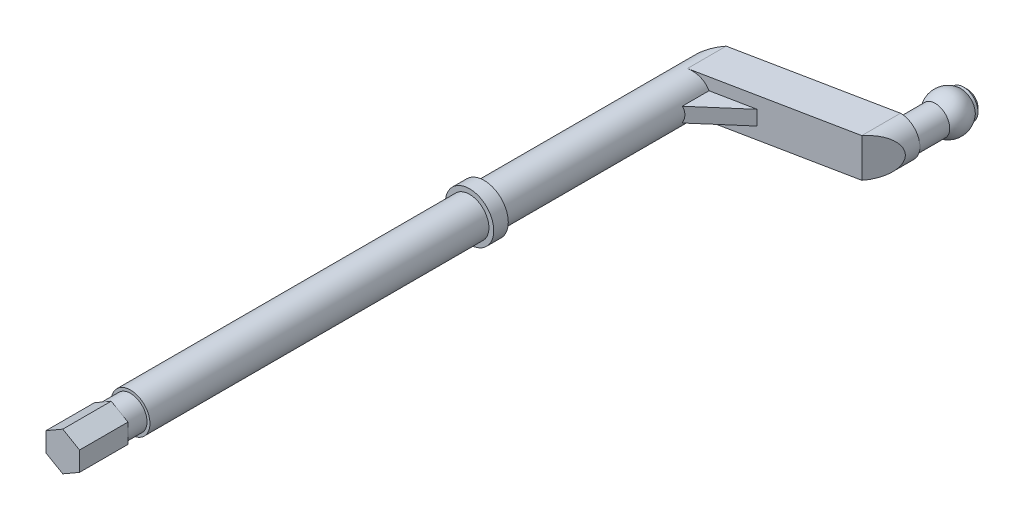
ISO-10303-21;
HEADER;
FILE_DESCRIPTION(('STEP AP214'),'2;1');
FILE_NAME('part.step','',(''),(''),'','','');
FILE_SCHEMA(('AUTOMOTIVE_DESIGN { 1 0 10303 214 1 1 1 1 }'));
ENDSEC;
DATA;
#1=APPLICATION_CONTEXT('core data for automotive mechanical design processes');
#2=APPLICATION_PROTOCOL_DEFINITION('international standard','automotive_design',2000,#1);
#3=PRODUCT_CONTEXT('',#1,'mechanical');
#4=PRODUCT('Part','Part','',(#3));
#5=PRODUCT_RELATED_PRODUCT_CATEGORY('part','',(#4));
#6=PRODUCT_DEFINITION_FORMATION('','',#4);
#7=PRODUCT_DEFINITION_CONTEXT('part definition',#1,'design');
#8=PRODUCT_DEFINITION('design','',#6,#7);
#9=PRODUCT_DEFINITION_SHAPE('','',#8);
#10=(LENGTH_UNIT() NAMED_UNIT(*) SI_UNIT(.MILLI.,.METRE.));
#11=(NAMED_UNIT(*) PLANE_ANGLE_UNIT() SI_UNIT($,.RADIAN.));
#12=(NAMED_UNIT(*) SI_UNIT($,.STERADIAN.) SOLID_ANGLE_UNIT());
#13=UNCERTAINTY_MEASURE_WITH_UNIT(LENGTH_MEASURE(1.E-05),#10,'distance_accuracy_value','');
#14=(GEOMETRIC_REPRESENTATION_CONTEXT(3) GLOBAL_UNCERTAINTY_ASSIGNED_CONTEXT((#13)) GLOBAL_UNIT_ASSIGNED_CONTEXT((#10,
#11,#12)) REPRESENTATION_CONTEXT('',''));
#15=CARTESIAN_POINT('',(0.,0.,0.));
#16=DIRECTION('',(0.,0.,1.));
#17=DIRECTION('',(1.,0.,0.));
#18=AXIS2_PLACEMENT_3D('',#15,#16,#17);
#19=CARTESIAN_POINT('',(0.,0.,61.5));
#20=DIRECTION('',(0.,0.,-1.));
#21=DIRECTION('',(-1.,0.,0.));
#22=AXIS2_PLACEMENT_3D('',#19,#20,#21);
#23=CYLINDRICAL_SURFACE('',#22,2.);
#24=CARTESIAN_POINT('',(0.,0.,25.));
#25=DIRECTION('',(0.,0.,1.));
#26=DIRECTION('',(1.,0.,0.));
#27=AXIS2_PLACEMENT_3D('',#24,#25,#26);
#28=CIRCLE('',#27,2.);
#29=CARTESIAN_POINT('',(2.,0.,25.));
#30=VERTEX_POINT('',#29);
#31=EDGE_CURVE('E147',#30,#30,#28,.T.);
#32=ORIENTED_EDGE('',*,*,#31,.F.);
#33=EDGE_LOOP('',(#32));
#34=FACE_BOUND('',#33,.T.);
#35=DIRECTION('',(0.,0.,-1.));
#36=VECTOR('',#35,1.);
#37=CARTESIAN_POINT('',(1.85404962177392,-0.75,61.5));
#38=LINE('',#37,#36);
#39=CARTESIAN_POINT('',(1.85404962177386,-0.75,6.39315699446265));
#40=VERTEX_POINT('',#39);
#41=CARTESIAN_POINT('',(1.85404962177392,-0.75,3.62919007564522));
#42=VERTEX_POINT('',#41);
#43=EDGE_CURVE('E49',#40,#42,#38,.T.);
#44=ORIENTED_EDGE('',*,*,#43,.F.);
#45=CARTESIAN_POINT('',(0.,0.,8.00000000000016));
#46=DIRECTION('',(0.654930538417853,0.,0.755689082789808));
#47=DIRECTION('',(0.755689082789808,0.,-0.654930538417853));
#48=AXIS2_PLACEMENT_3D('',#45,#46,#47);
#49=ELLIPSE('',#48,2.64659109883726,2.);
#50=CARTESIAN_POINT('',(1.85404962177392,0.75,6.39315699446261));
#51=VERTEX_POINT('',#50);
#52=EDGE_CURVE('E53',#40,#51,#49,.T.);
#53=ORIENTED_EDGE('',*,*,#52,.T.);
#54=DIRECTION('',(0.,0.,-1.));
#55=VECTOR('',#54,1.);
#56=CARTESIAN_POINT('',(1.85404962177392,0.75,61.5));
#57=LINE('',#56,#55);
#58=CARTESIAN_POINT('',(1.85404962177392,0.75,3.62919007564522));
#59=VERTEX_POINT('',#58);
#60=EDGE_CURVE('E149',#51,#59,#57,.T.);
#61=ORIENTED_EDGE('',*,*,#60,.T.);
#62=CARTESIAN_POINT('',(0.,0.,4.));
#63=DIRECTION('',(0.196116135138184,0.,0.98058067569092));
#64=DIRECTION('',(0.98058067569092,0.,-0.196116135138184));
#65=AXIS2_PLACEMENT_3D('',#62,#63,#64);
#66=ELLIPSE('',#65,2.03960780543711,2.);
#67=CARTESIAN_POINT('',(0.,2.,4.));
#68=VERTEX_POINT('',#67);
#69=EDGE_CURVE('E136',#59,#68,#66,.T.);
#70=ORIENTED_EDGE('',*,*,#69,.T.);
#71=DIRECTION('',(0.,0.,1.));
#72=VECTOR('',#71,1.);
#73=CARTESIAN_POINT('',(0.,2.,4.));
#74=LINE('',#73,#72);
#75=CARTESIAN_POINT('',(0.,2.,0.));
#76=VERTEX_POINT('',#75);
#77=EDGE_CURVE('E190',#76,#68,#74,.T.);
#78=ORIENTED_EDGE('',*,*,#77,.F.);
#79=CARTESIAN_POINT('',(0.,0.,0.));
#80=DIRECTION('',(0.78086880944303,0.,0.624695047554424));
#81=DIRECTION('',(0.624695047554424,0.,-0.78086880944303));
#82=AXIS2_PLACEMENT_3D('',#79,#80,#81);
#83=ELLIPSE('',#82,3.20156211871643,2.);
#84=CARTESIAN_POINT('',(0.,-2.,0.));
#85=VERTEX_POINT('',#84);
#86=EDGE_CURVE('E185',#85,#76,#83,.F.);
#87=ORIENTED_EDGE('',*,*,#86,.F.);
#88=DIRECTION('',(0.,0.,1.));
#89=VECTOR('',#88,1.);
#90=CARTESIAN_POINT('',(0.,-2.,4.));
#91=LINE('',#90,#89);
#92=CARTESIAN_POINT('',(0.,-2.,4.));
#93=VERTEX_POINT('',#92);
#94=EDGE_CURVE('E199',#85,#93,#91,.T.);
#95=ORIENTED_EDGE('',*,*,#94,.T.);
#96=EDGE_CURVE('E146',#93,#42,#66,.T.);
#97=ORIENTED_EDGE('',*,*,#96,.T.);
#98=EDGE_LOOP('',(#44,#53,#61,#70,#78,#87,#95,#97));
#99=FACE_BOUND('',#98,.T.);
#100=ADVANCED_FACE('F34',(#34,#99),#23,.T.);
#101=CARTESIAN_POINT('',(15.,-2.,1.));
#102=DIRECTION('',(0.196116135138184,0.,0.98058067569092));
#103=DIRECTION('',(0.98058067569092,0.,-0.196116135138184));
#104=AXIS2_PLACEMENT_3D('',#101,#102,#103);
#105=PLANE('',#104);
#106=DIRECTION('',(0.,1.,0.));
#107=VECTOR('',#106,1.);
#108=CARTESIAN_POINT('',(6.,-2.,2.8));
#109=LINE('',#108,#107);
#110=CARTESIAN_POINT('',(6.,-0.75,2.8));
#111=VERTEX_POINT('',#110);
#112=CARTESIAN_POINT('',(5.99999999999998,0.75,2.80000000000001));
#113=VERTEX_POINT('',#112);
#114=EDGE_CURVE('E42',#111,#113,#109,.T.);
#115=ORIENTED_EDGE('',*,*,#114,.F.);
#116=DIRECTION('',(-0.98058067569092,0.,0.196116135138184));
#117=VECTOR('',#116,1.);
#118=CARTESIAN_POINT('',(15.,-0.75,1.));
#119=LINE('',#118,#117);
#120=EDGE_CURVE('E11',#111,#42,#119,.T.);
#121=ORIENTED_EDGE('',*,*,#120,.T.);
#122=ORIENTED_EDGE('',*,*,#96,.F.);
#123=DIRECTION('',(0.98058067569092,0.,-0.196116135138184));
#124=VECTOR('',#123,1.);
#125=CARTESIAN_POINT('',(15.,-2.,1.));
#126=LINE('',#125,#124);
#127=CARTESIAN_POINT('',(15.,-2.,1.));
#128=VERTEX_POINT('',#127);
#129=EDGE_CURVE('E202',#93,#128,#126,.T.);
#130=ORIENTED_EDGE('',*,*,#129,.T.);
#131=DIRECTION('',(0.,1.,0.));
#132=VECTOR('',#131,1.);
#133=CARTESIAN_POINT('',(15.,-2.,1.));
#134=LINE('',#133,#132);
#135=CARTESIAN_POINT('',(15.,2.,1.));
#136=VERTEX_POINT('',#135);
#137=EDGE_CURVE('E211',#128,#136,#134,.T.);
#138=ORIENTED_EDGE('',*,*,#137,.T.);
#139=DIRECTION('',(0.98058067569092,0.,-0.196116135138184));
#140=VECTOR('',#139,1.);
#141=CARTESIAN_POINT('',(15.,2.,1.));
#142=LINE('',#141,#140);
#143=EDGE_CURVE('E143',#68,#136,#142,.T.);
#144=ORIENTED_EDGE('',*,*,#143,.F.);
#145=ORIENTED_EDGE('',*,*,#69,.F.);
#146=DIRECTION('',(-0.98058067569092,0.,0.196116135138184));
#147=VECTOR('',#146,1.);
#148=CARTESIAN_POINT('',(15.,0.75,1.));
#149=LINE('',#148,#147);
#150=EDGE_CURVE('E139',#113,#59,#149,.T.);
#151=ORIENTED_EDGE('',*,*,#150,.F.);
#152=EDGE_LOOP('',(#115,#121,#122,#130,#138,#144,#145,#151));
#153=FACE_BOUND('',#152,.T.);
#154=ADVANCED_FACE('F137',(#153),#105,.T.);
#155=CARTESIAN_POINT('',(15.4,0.,500000.));
#156=DIRECTION('',(0.,0.,-1.));
#157=DIRECTION('',(-1.,0.,0.));
#158=AXIS2_PLACEMENT_3D('',#155,#156,#157);
#159=CYLINDRICAL_SURFACE('',#158,1.5);
#160=CARTESIAN_POINT('',(15.4,0.,-3.07999999995445));
#161=DIRECTION('',(-0.196116135138184,0.,-0.98058067569092));
#162=DIRECTION('',(0.98058067569092,0.,-0.196116135138184));
#163=AXIS2_PLACEMENT_3D('',#160,#161,#162);
#164=ELLIPSE('',#163,1.52970585407784,1.5);
#165=CARTESIAN_POINT('',(15.,1.4456832294801,-3.));
#166=VERTEX_POINT('',#165);
#167=CARTESIAN_POINT('',(15.,-1.4456832294801,-3.));
#168=VERTEX_POINT('',#167);
#169=EDGE_CURVE('E176',#166,#168,#164,.F.);
#170=ORIENTED_EDGE('',*,*,#169,.F.);
#171=CARTESIAN_POINT('',(15.4,0.,-3.));
#172=DIRECTION('',(0.,0.,-1.));
#173=DIRECTION('',(-1.,0.,0.));
#174=AXIS2_PLACEMENT_3D('',#171,#172,#173);
#175=CIRCLE('',#174,1.5);
#176=EDGE_CURVE('E168',#166,#168,#175,.T.);
#177=ORIENTED_EDGE('',*,*,#176,.T.);
#178=EDGE_LOOP('',(#170,#177));
#179=FACE_BOUND('',#178,.T.);
#180=CARTESIAN_POINT('',(15.4,0.,-6.17712434446088));
#181=DIRECTION('',(0.,0.,-1.));
#182=DIRECTION('',(-1.,0.,0.));
#183=AXIS2_PLACEMENT_3D('',#180,#181,#182);
#184=CIRCLE('',#183,1.5);
#185=CARTESIAN_POINT('',(16.899999999994,0.,-6.17712434446088));
#186=VERTEX_POINT('',#185);
#187=EDGE_CURVE('E169',#186,#186,#184,.F.);
#188=ORIENTED_EDGE('',*,*,#187,.T.);
#189=EDGE_LOOP('',(#188));
#190=FACE_BOUND('',#189,.T.);
#191=ADVANCED_FACE('F301',(#179,#190),#159,.T.);
#192=CARTESIAN_POINT('',(0.,-2.,0.));
#193=DIRECTION('',(-0.196116135138184,0.,-0.98058067569092));
#194=DIRECTION('',(-0.98058067569092,0.,0.196116135138184));
#195=AXIS2_PLACEMENT_3D('',#192,#193,#194);
#196=PLANE('',#195);
#197=ORIENTED_EDGE('',*,*,#169,.T.);
#198=DIRECTION('',(0.,1.,0.));
#199=VECTOR('',#198,1.);
#200=CARTESIAN_POINT('',(15.,-2.501,-3.));
#201=LINE('',#200,#199);
#202=CARTESIAN_POINT('',(15.,-2.,-3.));
#203=VERTEX_POINT('',#202);
#204=EDGE_CURVE('E175',#203,#168,#201,.T.);
#205=ORIENTED_EDGE('',*,*,#204,.F.);
#206=DIRECTION('',(-0.98058067569092,0.,0.196116135138184));
#207=VECTOR('',#206,1.);
#208=CARTESIAN_POINT('',(0.,-2.,0.));
#209=LINE('',#208,#207);
#210=EDGE_CURVE('E208',#203,#85,#209,.T.);
#211=ORIENTED_EDGE('',*,*,#210,.T.);
#212=DIRECTION('',(0.,1.,0.));
#213=VECTOR('',#212,1.);
#214=CARTESIAN_POINT('',(0.,-2.,0.));
#215=LINE('',#214,#213);
#216=EDGE_CURVE('E212',#85,#76,#215,.T.);
#217=ORIENTED_EDGE('',*,*,#216,.T.);
#218=DIRECTION('',(-0.98058067569092,0.,0.196116135138184));
#219=VECTOR('',#218,1.);
#220=CARTESIAN_POINT('',(0.,2.,0.));
#221=LINE('',#220,#219);
#222=CARTESIAN_POINT('',(15.,2.,-3.));
#223=VERTEX_POINT('',#222);
#224=EDGE_CURVE('E196',#223,#76,#221,.T.);
#225=ORIENTED_EDGE('',*,*,#224,.F.);
#226=EDGE_CURVE('E172',#166,#223,#201,.T.);
#227=ORIENTED_EDGE('',*,*,#226,.F.);
#228=EDGE_LOOP('',(#197,#205,#211,#217,#225,#227));
#229=FACE_BOUND('',#228,.T.);
#230=ADVANCED_FACE('F298',(#229),#196,.T.);
#231=CARTESIAN_POINT('',(0.,0.,61.5));
#232=DIRECTION('',(0.,0.,1.));
#233=DIRECTION('',(1.,0.,0.));
#234=AXIS2_PLACEMENT_3D('',#231,#232,#233);
#235=PLANE('',#234);
#236=CARTESIAN_POINT('',(0.,0.,61.5));
#237=DIRECTION('',(0.,0.,1.));
#238=DIRECTION('',(1.,0.,0.));
#239=AXIS2_PLACEMENT_3D('',#236,#237,#238);
#240=CIRCLE('',#239,2.);
#241=CARTESIAN_POINT('',(2.,0.,61.5));
#242=VERTEX_POINT('',#241);
#243=EDGE_CURVE('E273',#242,#242,#240,.T.);
#244=ORIENTED_EDGE('',*,*,#243,.T.);
#245=EDGE_LOOP('',(#244));
#246=FACE_BOUND('',#245,.T.);
#247=CARTESIAN_POINT('',(0.,0.,61.5));
#248=DIRECTION('',(0.,0.,1.));
#249=DIRECTION('',(1.,0.,0.));
#250=AXIS2_PLACEMENT_3D('',#247,#248,#249);
#251=CIRCLE('',#250,1.7);
#252=CARTESIAN_POINT('',(1.7,0.,61.5));
#253=VERTEX_POINT('',#252);
#254=EDGE_CURVE('E260',#253,#253,#251,.T.);
#255=ORIENTED_EDGE('',*,*,#254,.F.);
#256=EDGE_LOOP('',(#255));
#257=FACE_BOUND('',#256,.T.);
#258=ADVANCED_FACE('F355',(#246,#257),#235,.T.);
#259=CARTESIAN_POINT('',(0.,0.,25.));
#260=DIRECTION('',(0.,0.,1.));
#261=DIRECTION('',(1.,0.,0.));
#262=AXIS2_PLACEMENT_3D('',#259,#260,#261);
#263=PLANE('',#262);
#264=CARTESIAN_POINT('',(0.,0.,25.));
#265=DIRECTION('',(0.,0.,1.));
#266=DIRECTION('',(1.,0.,0.));
#267=AXIS2_PLACEMENT_3D('',#264,#265,#266);
#268=CIRCLE('',#267,2.5);
#269=CARTESIAN_POINT('',(2.5,0.,25.));
#270=VERTEX_POINT('',#269);
#271=EDGE_CURVE('E267',#270,#270,#268,.T.);
#272=ORIENTED_EDGE('',*,*,#271,.F.);
#273=EDGE_LOOP('',(#272));
#274=FACE_BOUND('',#273,.T.);
#275=ORIENTED_EDGE('',*,*,#31,.T.);
#276=EDGE_LOOP('',(#275));
#277=FACE_BOUND('',#276,.T.);
#278=ADVANCED_FACE('F358',(#274,#277),#263,.F.);
#279=CARTESIAN_POINT('',(0.,0.,26.5));
#280=DIRECTION('',(0.,0.,1.));
#281=DIRECTION('',(1.,0.,0.));
#282=AXIS2_PLACEMENT_3D('',#279,#280,#281);
#283=PLANE('',#282);
#284=CARTESIAN_POINT('',(0.,0.,26.5));
#285=DIRECTION('',(0.,0.,1.));
#286=DIRECTION('',(1.,0.,0.));
#287=AXIS2_PLACEMENT_3D('',#284,#285,#286);
#288=CIRCLE('',#287,2.5);
#289=CARTESIAN_POINT('',(2.5,0.,26.5));
#290=VERTEX_POINT('',#289);
#291=EDGE_CURVE('E264',#290,#290,#288,.T.);
#292=ORIENTED_EDGE('',*,*,#291,.T.);
#293=EDGE_LOOP('',(#292));
#294=FACE_BOUND('',#293,.T.);
#295=CARTESIAN_POINT('',(0.,0.,26.5));
#296=DIRECTION('',(0.,0.,1.));
#297=DIRECTION('',(1.,0.,0.));
#298=AXIS2_PLACEMENT_3D('',#295,#296,#297);
#299=CIRCLE('',#298,2.);
#300=CARTESIAN_POINT('',(2.,0.,26.5));
#301=VERTEX_POINT('',#300);
#302=EDGE_CURVE('E270',#301,#301,#299,.T.);
#303=ORIENTED_EDGE('',*,*,#302,.F.);
#304=EDGE_LOOP('',(#303));
#305=FACE_BOUND('',#304,.T.);
#306=ADVANCED_FACE('F348',(#294,#305),#283,.T.);
#307=CARTESIAN_POINT('',(0.,0.,25.));
#308=DIRECTION('',(0.,0.,1.));
#309=DIRECTION('',(1.,0.,0.));
#310=AXIS2_PLACEMENT_3D('',#307,#308,#309);
#311=CYLINDRICAL_SURFACE('',#310,2.5);
#312=ORIENTED_EDGE('',*,*,#271,.T.);
#313=EDGE_LOOP('',(#312));
#314=FACE_BOUND('',#313,.T.);
#315=ORIENTED_EDGE('',*,*,#291,.F.);
#316=EDGE_LOOP('',(#315));
#317=FACE_BOUND('',#316,.T.);
#318=ADVANCED_FACE('F339',(#314,#317),#311,.T.);
#319=ORIENTED_EDGE('',*,*,#302,.T.);
#320=EDGE_LOOP('',(#319));
#321=FACE_BOUND('',#320,.T.);
#322=ORIENTED_EDGE('',*,*,#243,.F.);
#323=EDGE_LOOP('',(#322));
#324=FACE_BOUND('',#323,.T.);
#325=ADVANCED_FACE('F330',(#321,#324),#23,.T.);
#326=CARTESIAN_POINT('',(0.,0.,63.5));
#327=DIRECTION('',(0.,0.,-1.));
#328=DIRECTION('',(-1.,0.,0.));
#329=AXIS2_PLACEMENT_3D('',#326,#327,#328);
#330=CYLINDRICAL_SURFACE('',#329,1.7);
#331=CARTESIAN_POINT('',(0.,0.,63.5));
#332=DIRECTION('',(0.,0.,1.));
#333=DIRECTION('',(1.,0.,0.));
#334=AXIS2_PLACEMENT_3D('',#331,#332,#333);
#335=CIRCLE('',#334,1.7);
#336=CARTESIAN_POINT('',(1.7,0.,63.5));
#337=VERTEX_POINT('',#336);
#338=EDGE_CURVE('E261',#337,#337,#335,.T.);
#339=ORIENTED_EDGE('',*,*,#338,.F.);
#340=EDGE_LOOP('',(#339));
#341=FACE_BOUND('',#340,.T.);
#342=ORIENTED_EDGE('',*,*,#254,.T.);
#343=EDGE_LOOP('',(#342));
#344=FACE_BOUND('',#343,.T.);
#345=ADVANCED_FACE('F338',(#341,#344),#330,.T.);
#346=CARTESIAN_POINT('',(0.,0.,63.5));
#347=DIRECTION('',(0.,0.,1.));
#348=DIRECTION('',(1.,0.,0.));
#349=AXIS2_PLACEMENT_3D('',#346,#347,#348);
#350=PLANE('',#349);
#351=DIRECTION('',(-0.866025403784439,0.5,0.));
#352=VECTOR('',#351,1.);
#353=CARTESIAN_POINT('',(1.73205080756888,1.,63.5));
#354=LINE('',#353,#352);
#355=CARTESIAN_POINT('',(1.73205080756888,1.,63.5));
#356=VERTEX_POINT('',#355);
#357=CARTESIAN_POINT('',(0.,2.,63.5));
#358=VERTEX_POINT('',#357);
#359=EDGE_CURVE('E215',#356,#358,#354,.T.);
#360=ORIENTED_EDGE('',*,*,#359,.F.);
#361=DIRECTION('',(0.,1.,0.));
#362=VECTOR('',#361,1.);
#363=CARTESIAN_POINT('',(1.73205080756888,-1.,63.5));
#364=LINE('',#363,#362);
#365=CARTESIAN_POINT('',(1.73205080756888,-1.,63.5));
#366=VERTEX_POINT('',#365);
#367=EDGE_CURVE('E221',#366,#356,#364,.T.);
#368=ORIENTED_EDGE('',*,*,#367,.F.);
#369=DIRECTION('',(0.866025403784439,0.5,0.));
#370=VECTOR('',#369,1.);
#371=CARTESIAN_POINT('',(0.,-2.,63.5));
#372=LINE('',#371,#370);
#373=CARTESIAN_POINT('',(0.,-2.,63.5));
#374=VERTEX_POINT('',#373);
#375=EDGE_CURVE('E240',#374,#366,#372,.T.);
#376=ORIENTED_EDGE('',*,*,#375,.F.);
#377=DIRECTION('',(0.866025403784439,-0.5,0.));
#378=VECTOR('',#377,1.);
#379=CARTESIAN_POINT('',(-1.73205080756888,-1.,63.5));
#380=LINE('',#379,#378);
#381=CARTESIAN_POINT('',(-1.73205080756888,-1.,63.5));
#382=VERTEX_POINT('',#381);
#383=EDGE_CURVE('E238',#382,#374,#380,.T.);
#384=ORIENTED_EDGE('',*,*,#383,.F.);
#385=DIRECTION('',(0.,-1.,0.));
#386=VECTOR('',#385,1.);
#387=CARTESIAN_POINT('',(-1.73205080756888,1.,63.5));
#388=LINE('',#387,#386);
#389=CARTESIAN_POINT('',(-1.73205080756888,1.,63.5));
#390=VERTEX_POINT('',#389);
#391=EDGE_CURVE('E236',#390,#382,#388,.T.);
#392=ORIENTED_EDGE('',*,*,#391,.F.);
#393=DIRECTION('',(-0.866025403784439,-0.5,0.));
#394=VECTOR('',#393,1.);
#395=CARTESIAN_POINT('',(0.,2.,63.5));
#396=LINE('',#395,#394);
#397=EDGE_CURVE('E234',#358,#390,#396,.T.);
#398=ORIENTED_EDGE('',*,*,#397,.F.);
#399=EDGE_LOOP('',(#360,#368,#376,#384,#392,#398));
#400=FACE_BOUND('',#399,.T.);
#401=ORIENTED_EDGE('',*,*,#338,.T.);
#402=EDGE_LOOP('',(#401));
#403=FACE_BOUND('',#402,.T.);
#404=ADVANCED_FACE('F345',(#400,#403),#350,.F.);
#405=CARTESIAN_POINT('',(1.73205080756888,1.,68.5));
#406=DIRECTION('',(-0.5,-0.866025403784439,0.));
#407=DIRECTION('',(0.866025403784439,-0.5,0.));
#408=AXIS2_PLACEMENT_3D('',#405,#406,#407);
#409=PLANE('',#408);
#410=ORIENTED_EDGE('',*,*,#359,.T.);
#411=DIRECTION('',(0.,0.,-1.));
#412=VECTOR('',#411,1.);
#413=CARTESIAN_POINT('',(0.,2.,68.5));
#414=LINE('',#413,#412);
#415=CARTESIAN_POINT('',(0.,2.,68.5));
#416=VERTEX_POINT('',#415);
#417=EDGE_CURVE('E257',#416,#358,#414,.T.);
#418=ORIENTED_EDGE('',*,*,#417,.F.);
#419=DIRECTION('',(-0.866025403784439,0.5,0.));
#420=VECTOR('',#419,1.);
#421=CARTESIAN_POINT('',(1.73205080756888,1.,68.5));
#422=LINE('',#421,#420);
#423=CARTESIAN_POINT('',(1.73205080756888,1.,68.5));
#424=VERTEX_POINT('',#423);
#425=EDGE_CURVE('E217',#424,#416,#422,.T.);
#426=ORIENTED_EDGE('',*,*,#425,.F.);
#427=DIRECTION('',(0.,0.,-1.));
#428=VECTOR('',#427,1.);
#429=CARTESIAN_POINT('',(1.73205080756888,1.,68.5));
#430=LINE('',#429,#428);
#431=EDGE_CURVE('E231',#424,#356,#430,.T.);
#432=ORIENTED_EDGE('',*,*,#431,.T.);
#433=EDGE_LOOP('',(#410,#418,#426,#432));
#434=FACE_BOUND('',#433,.T.);
#435=ADVANCED_FACE('F372',(#434),#409,.F.);
#436=CARTESIAN_POINT('',(0.,2.,68.5));
#437=DIRECTION('',(0.5,-0.866025403784439,0.));
#438=DIRECTION('',(0.866025403784439,0.5,0.));
#439=AXIS2_PLACEMENT_3D('',#436,#437,#438);
#440=PLANE('',#439);
#441=ORIENTED_EDGE('',*,*,#397,.T.);
#442=DIRECTION('',(0.,0.,-1.));
#443=VECTOR('',#442,1.);
#444=CARTESIAN_POINT('',(-1.73205080756888,1.,68.5));
#445=LINE('',#444,#443);
#446=CARTESIAN_POINT('',(-1.73205080756888,1.,68.5));
#447=VERTEX_POINT('',#446);
#448=EDGE_CURVE('E254',#447,#390,#445,.T.);
#449=ORIENTED_EDGE('',*,*,#448,.F.);
#450=DIRECTION('',(-0.866025403784439,-0.5,0.));
#451=VECTOR('',#450,1.);
#452=CARTESIAN_POINT('',(0.,2.,68.5));
#453=LINE('',#452,#451);
#454=EDGE_CURVE('E220',#416,#447,#453,.T.);
#455=ORIENTED_EDGE('',*,*,#454,.F.);
#456=ORIENTED_EDGE('',*,*,#417,.T.);
#457=EDGE_LOOP('',(#441,#449,#455,#456));
#458=FACE_BOUND('',#457,.T.);
#459=ADVANCED_FACE('F375',(#458),#440,.F.);
#460=CARTESIAN_POINT('',(-1.73205080756888,1.,68.5));
#461=DIRECTION('',(1.,0.,0.));
#462=DIRECTION('',(0.,1.,0.));
#463=AXIS2_PLACEMENT_3D('',#460,#461,#462);
#464=PLANE('',#463);
#465=ORIENTED_EDGE('',*,*,#391,.T.);
#466=DIRECTION('',(0.,0.,-1.));
#467=VECTOR('',#466,1.);
#468=CARTESIAN_POINT('',(-1.73205080756888,-1.,68.5));
#469=LINE('',#468,#467);
#470=CARTESIAN_POINT('',(-1.73205080756888,-1.,68.5));
#471=VERTEX_POINT('',#470);
#472=EDGE_CURVE('E251',#471,#382,#469,.T.);
#473=ORIENTED_EDGE('',*,*,#472,.F.);
#474=DIRECTION('',(0.,-1.,0.));
#475=VECTOR('',#474,1.);
#476=CARTESIAN_POINT('',(-1.73205080756888,1.,68.5));
#477=LINE('',#476,#475);
#478=EDGE_CURVE('E223',#447,#471,#477,.T.);
#479=ORIENTED_EDGE('',*,*,#478,.F.);
#480=ORIENTED_EDGE('',*,*,#448,.T.);
#481=EDGE_LOOP('',(#465,#473,#479,#480));
#482=FACE_BOUND('',#481,.T.);
#483=ADVANCED_FACE('F379',(#482),#464,.F.);
#484=CARTESIAN_POINT('',(-1.73205080756888,-1.,68.5));
#485=DIRECTION('',(0.5,0.866025403784439,0.));
#486=DIRECTION('',(-0.866025403784439,0.5,0.));
#487=AXIS2_PLACEMENT_3D('',#484,#485,#486);
#488=PLANE('',#487);
#489=ORIENTED_EDGE('',*,*,#383,.T.);
#490=DIRECTION('',(0.,0.,-1.));
#491=VECTOR('',#490,1.);
#492=CARTESIAN_POINT('',(0.,-2.,68.5));
#493=LINE('',#492,#491);
#494=CARTESIAN_POINT('',(0.,-2.,68.5));
#495=VERTEX_POINT('',#494);
#496=EDGE_CURVE('E248',#495,#374,#493,.T.);
#497=ORIENTED_EDGE('',*,*,#496,.F.);
#498=DIRECTION('',(0.866025403784439,-0.5,0.));
#499=VECTOR('',#498,1.);
#500=CARTESIAN_POINT('',(-1.73205080756888,-1.,68.5));
#501=LINE('',#500,#499);
#502=EDGE_CURVE('E225',#471,#495,#501,.T.);
#503=ORIENTED_EDGE('',*,*,#502,.F.);
#504=ORIENTED_EDGE('',*,*,#472,.T.);
#505=EDGE_LOOP('',(#489,#497,#503,#504));
#506=FACE_BOUND('',#505,.T.);
#507=ADVANCED_FACE('F383',(#506),#488,.F.);
#508=CARTESIAN_POINT('',(0.,-2.,68.5));
#509=DIRECTION('',(-0.5,0.866025403784439,0.));
#510=DIRECTION('',(-0.866025403784439,-0.5,0.));
#511=AXIS2_PLACEMENT_3D('',#508,#509,#510);
#512=PLANE('',#511);
#513=ORIENTED_EDGE('',*,*,#375,.T.);
#514=DIRECTION('',(0.,0.,-1.));
#515=VECTOR('',#514,1.);
#516=CARTESIAN_POINT('',(1.73205080756888,-1.,68.5));
#517=LINE('',#516,#515);
#518=CARTESIAN_POINT('',(1.73205080756888,-1.,68.5));
#519=VERTEX_POINT('',#518);
#520=EDGE_CURVE('E245',#519,#366,#517,.T.);
#521=ORIENTED_EDGE('',*,*,#520,.F.);
#522=DIRECTION('',(0.866025403784439,0.5,0.));
#523=VECTOR('',#522,1.);
#524=CARTESIAN_POINT('',(0.,-2.,68.5));
#525=LINE('',#524,#523);
#526=EDGE_CURVE('E227',#495,#519,#525,.T.);
#527=ORIENTED_EDGE('',*,*,#526,.F.);
#528=ORIENTED_EDGE('',*,*,#496,.T.);
#529=EDGE_LOOP('',(#513,#521,#527,#528));
#530=FACE_BOUND('',#529,.T.);
#531=ADVANCED_FACE('F387',(#530),#512,.F.);
#532=CARTESIAN_POINT('',(1.73205080756888,-1.,68.5));
#533=DIRECTION('',(-1.,0.,0.));
#534=DIRECTION('',(0.,-1.,0.));
#535=AXIS2_PLACEMENT_3D('',#532,#533,#534);
#536=PLANE('',#535);
#537=ORIENTED_EDGE('',*,*,#367,.T.);
#538=ORIENTED_EDGE('',*,*,#431,.F.);
#539=DIRECTION('',(0.,1.,0.));
#540=VECTOR('',#539,1.);
#541=CARTESIAN_POINT('',(1.73205080756888,-1.,68.5));
#542=LINE('',#541,#540);
#543=EDGE_CURVE('E229',#519,#424,#542,.T.);
#544=ORIENTED_EDGE('',*,*,#543,.F.);
#545=ORIENTED_EDGE('',*,*,#520,.T.);
#546=EDGE_LOOP('',(#537,#538,#544,#545));
#547=FACE_BOUND('',#546,.T.);
#548=ADVANCED_FACE('F391',(#547),#536,.F.);
#549=CARTESIAN_POINT('',(0.,0.,68.5));
#550=DIRECTION('',(0.,0.,1.));
#551=DIRECTION('',(1.,0.,0.));
#552=AXIS2_PLACEMENT_3D('',#549,#550,#551);
#553=PLANE('',#552);
#554=ORIENTED_EDGE('',*,*,#425,.T.);
#555=ORIENTED_EDGE('',*,*,#454,.T.);
#556=ORIENTED_EDGE('',*,*,#478,.T.);
#557=ORIENTED_EDGE('',*,*,#502,.T.);
#558=ORIENTED_EDGE('',*,*,#526,.T.);
#559=ORIENTED_EDGE('',*,*,#543,.T.);
#560=EDGE_LOOP('',(#554,#555,#556,#557,#558,#559));
#561=FACE_BOUND('',#560,.T.);
#562=ADVANCED_FACE('F395',(#561),#553,.T.);
#563=CARTESIAN_POINT('',(0.,-2.,0.));
#564=DIRECTION('',(0.,-1.,0.));
#565=DIRECTION('',(0.,0.,-1.));
#566=AXIS2_PLACEMENT_3D('',#563,#564,#565);
#567=PLANE('',#566);
#568=ORIENTED_EDGE('',*,*,#94,.F.);
#569=ORIENTED_EDGE('',*,*,#210,.F.);
#570=DIRECTION('',(0.,0.,-1.));
#571=VECTOR('',#570,1.);
#572=CARTESIAN_POINT('',(15.,-2.,-3.));
#573=LINE('',#572,#571);
#574=EDGE_CURVE('E205',#128,#203,#573,.T.);
#575=ORIENTED_EDGE('',*,*,#574,.F.);
#576=ORIENTED_EDGE('',*,*,#129,.F.);
#577=EDGE_LOOP('',(#568,#569,#575,#576));
#578=FACE_BOUND('',#577,.T.);
#579=ADVANCED_FACE('F311',(#578),#567,.T.);
#580=CARTESIAN_POINT('',(0.,2.,0.));
#581=DIRECTION('',(0.,-1.,0.));
#582=DIRECTION('',(0.,0.,-1.));
#583=AXIS2_PLACEMENT_3D('',#580,#581,#582);
#584=PLANE('',#583);
#585=ORIENTED_EDGE('',*,*,#77,.T.);
#586=ORIENTED_EDGE('',*,*,#143,.T.);
#587=DIRECTION('',(0.,0.,-1.));
#588=VECTOR('',#587,1.);
#589=CARTESIAN_POINT('',(15.,2.,-3.));
#590=LINE('',#589,#588);
#591=EDGE_CURVE('E193',#136,#223,#590,.T.);
#592=ORIENTED_EDGE('',*,*,#591,.T.);
#593=ORIENTED_EDGE('',*,*,#224,.T.);
#594=EDGE_LOOP('',(#585,#586,#592,#593));
#595=FACE_BOUND('',#594,.T.);
#596=ADVANCED_FACE('F314',(#595),#584,.F.);
#597=CARTESIAN_POINT('',(15.,0.,-3.));
#598=DIRECTION('',(0.,0.,1.));
#599=DIRECTION('',(1.,0.,0.));
#600=AXIS2_PLACEMENT_3D('',#597,#598,#599);
#601=CYLINDRICAL_SURFACE('',#600,2.);
#602=ORIENTED_EDGE('',*,*,#591,.F.);
#603=CARTESIAN_POINT('',(15.,0.,1.));
#604=DIRECTION('',(-0.780868809443031,0.,-0.624695047554424));
#605=DIRECTION('',(-0.624695047554424,0.,0.780868809443031));
#606=AXIS2_PLACEMENT_3D('',#603,#604,#605);
#607=ELLIPSE('',#606,3.20156211871643,2.);
#608=EDGE_CURVE('E182',#128,#136,#607,.F.);
#609=ORIENTED_EDGE('',*,*,#608,.F.);
#610=ORIENTED_EDGE('',*,*,#574,.T.);
#611=CARTESIAN_POINT('',(15.,0.,-3.));
#612=DIRECTION('',(0.,0.,-1.));
#613=DIRECTION('',(-1.,0.,0.));
#614=AXIS2_PLACEMENT_3D('',#611,#612,#613);
#615=CIRCLE('',#614,2.);
#616=EDGE_CURVE('E187',#223,#203,#615,.T.);
#617=ORIENTED_EDGE('',*,*,#616,.F.);
#618=EDGE_LOOP('',(#602,#609,#610,#617));
#619=FACE_BOUND('',#618,.T.);
#620=ADVANCED_FACE('F326',(#619),#601,.T.);
#621=CARTESIAN_POINT('',(15.,0.,-3.));
#622=DIRECTION('',(0.,0.,-1.));
#623=DIRECTION('',(-1.,0.,0.));
#624=AXIS2_PLACEMENT_3D('',#621,#622,#623);
#625=PLANE('',#624);
#626=ORIENTED_EDGE('',*,*,#176,.F.);
#627=ORIENTED_EDGE('',*,*,#226,.T.);
#628=ORIENTED_EDGE('',*,*,#616,.T.);
#629=ORIENTED_EDGE('',*,*,#204,.T.);
#630=EDGE_LOOP('',(#626,#627,#628,#629));
#631=FACE_BOUND('',#630,.T.);
#632=ADVANCED_FACE('F304',(#631),#625,.T.);
#633=CARTESIAN_POINT('',(-2.,-2.501,2.5));
#634=DIRECTION('',(0.78086880944303,0.,0.624695047554424));
#635=DIRECTION('',(0.624695047554424,0.,-0.78086880944303));
#636=AXIS2_PLACEMENT_3D('',#633,#634,#635);
#637=PLANE('',#636);
#638=ORIENTED_EDGE('',*,*,#86,.T.);
#639=ORIENTED_EDGE('',*,*,#216,.F.);
#640=EDGE_LOOP('',(#638,#639));
#641=FACE_BOUND('',#640,.T.);
#642=ADVANCED_FACE('F315',(#641),#637,.F.);
#643=CARTESIAN_POINT('',(15.,-2.501,1.));
#644=DIRECTION('',(-0.780868809443031,0.,-0.624695047554424));
#645=DIRECTION('',(-0.624695047554424,0.,0.780868809443031));
#646=AXIS2_PLACEMENT_3D('',#643,#644,#645);
#647=PLANE('',#646);
#648=ORIENTED_EDGE('',*,*,#608,.T.);
#649=ORIENTED_EDGE('',*,*,#137,.F.);
#650=EDGE_LOOP('',(#648,#649));
#651=FACE_BOUND('',#650,.T.);
#652=ADVANCED_FACE('F317',(#651),#647,.F.);
#653=CARTESIAN_POINT('',(15.4,0.,-7.5));
#654=DIRECTION('',(0.,0.,-1.));
#655=DIRECTION('',(1.,0.,0.));
#656=AXIS2_PLACEMENT_3D('',#653,#654,#655);
#657=SPHERICAL_SURFACE('',#656,2.);
#658=CARTESIAN_POINT('',(15.4,0.,-8.82287565552547));
#659=DIRECTION('',(0.,0.,1.));
#660=DIRECTION('',(1.,0.,0.));
#661=AXIS2_PLACEMENT_3D('',#658,#659,#660);
#662=CIRCLE('',#661,1.5);
#663=CARTESIAN_POINT('',(16.900000000006,0.,-8.82287565552548));
#664=VERTEX_POINT('',#663);
#665=EDGE_CURVE('E165',#664,#664,#662,.F.);
#666=CARTESIAN_POINT('',(16.900000000006,0.,-8.82287565552548));
#667=CARTESIAN_POINT('',(16.9199188782791,0.,-8.80029052322807));
#668=CARTESIAN_POINT('',(16.9393268949561,0.,-8.77725490532221));
#669=CARTESIAN_POINT('',(16.9770833164109,0.,-8.73033106418861));
#670=CARTESIAN_POINT('',(16.9954317211888,0.,-8.70644284096088));
#671=CARTESIAN_POINT('',(17.0310310301386,0.,-8.65786215507861));
#672=CARTESIAN_POINT('',(17.0482819343105,0.,-8.63316969242406));
#673=CARTESIAN_POINT('',(17.0816511715302,0.,-8.58303100034411));
#674=CARTESIAN_POINT('',(17.0977695045781,0.,-8.5575847709187));
#675=CARTESIAN_POINT('',(17.128840684346,0.,-8.50599043080324));
#676=CARTESIAN_POINT('',(17.1437935310662,0.,-8.4798423201132));
#677=CARTESIAN_POINT('',(17.172503242226,0.,-8.42689756831806));
#678=CARTESIAN_POINT('',(17.1862601066658,0.,-8.40010092721296));
#679=CARTESIAN_POINT('',(17.2125497860479,0.,-8.34591377951379));
#680=CARTESIAN_POINT('',(17.2250826009902,0.,-8.31852327291972));
#681=CARTESIAN_POINT('',(17.2488986142833,0.,-8.26320427309377));
#682=CARTESIAN_POINT('',(17.2601818126341,0.,-8.23527577986191));
#683=CARTESIAN_POINT('',(17.2814755741462,0.,-8.17893778249417));
#684=CARTESIAN_POINT('',(17.2914861373075,0.,-8.1505282783583));
#685=CARTESIAN_POINT('',(17.3102142063119,0.,-8.09328621638111));
#686=CARTESIAN_POINT('',(17.3189317121551,0.,-8.06445365853978));
#687=CARTESIAN_POINT('',(17.335055882255,0.,-8.00642430935997));
#688=CARTESIAN_POINT('',(17.3424625465117,0.,-7.97722751802149));
#689=CARTESIAN_POINT('',(17.3559499233846,0.,-7.91852926512713));
#690=CARTESIAN_POINT('',(17.3620306360007,0.,-7.88902780357125));
#691=CARTESIAN_POINT('',(17.372853704558,0.,-7.8297803950648));
#692=CARTESIAN_POINT('',(17.3775960604992,0.,-7.80003444811423));
#693=CARTESIAN_POINT('',(17.3857327410047,0.,-7.74035875240746));
#694=CARTESIAN_POINT('',(17.389127065569,0.,-7.71042900365126));
#695=CARTESIAN_POINT('',(17.3945607586868,0.,-7.65044676288922));
#696=CARTESIAN_POINT('',(17.3966001272402,0.,-7.62039427088338));
#697=CARTESIAN_POINT('',(17.3993197478968,0.,-7.56022785258199));
#698=CARTESIAN_POINT('',(17.4000000000001,0.,-7.53011392628645));
#699=CARTESIAN_POINT('',(17.3999999999999,0.,-7.46988607369536));
#700=CARTESIAN_POINT('',(17.3993197478963,0.,-7.43977214739982));
#701=CARTESIAN_POINT('',(17.3966001272391,0.,-7.37960572909846));
#702=CARTESIAN_POINT('',(17.3945607586854,0.,-7.34955323709264));
#703=CARTESIAN_POINT('',(17.3891270655671,0.,-7.28957099633065));
#704=CARTESIAN_POINT('',(17.3857327410025,0.,-7.25964124757448));
#705=CARTESIAN_POINT('',(17.3775960604964,0.,-7.19996555186779));
#706=CARTESIAN_POINT('',(17.372853704555,0.,-7.17021960491726));
#707=CARTESIAN_POINT('',(17.3620306359971,0.,-7.11097219641091));
#708=CARTESIAN_POINT('',(17.3559499233808,0.,-7.08147073485509));
#709=CARTESIAN_POINT('',(17.3424625465074,0.,-7.02277248196085));
#710=CARTESIAN_POINT('',(17.3350558822504,0.,-6.99357569062243));
#711=CARTESIAN_POINT('',(17.31893171215,0.,-6.93554634144277));
#712=CARTESIAN_POINT('',(17.3102142063065,0.,-6.90671378360152));
#713=CARTESIAN_POINT('',(17.2914861373016,0.,-6.8494717216245));
#714=CARTESIAN_POINT('',(17.2814755741401,0.,-6.82106221748872));
#715=CARTESIAN_POINT('',(17.2601818126274,0.,-6.76472422012117));
#716=CARTESIAN_POINT('',(17.2488986142763,0.,-6.73679572688941));
#717=CARTESIAN_POINT('',(17.2250826009827,0.,-6.68147672706369));
#718=CARTESIAN_POINT('',(17.2125497860402,0.,-6.65408622046972));
#719=CARTESIAN_POINT('',(17.1862601066576,0.,-6.59989907277079));
#720=CARTESIAN_POINT('',(17.1725032422176,0.,-6.57310243166582));
#721=CARTESIAN_POINT('',(17.1437935310572,0.,-6.52015767987094));
#722=CARTESIAN_POINT('',(17.1288406843369,0.,-6.49400956918103));
#723=CARTESIAN_POINT('',(17.0977695045684,0.,-6.44241522906586));
#724=CARTESIAN_POINT('',(17.0816511715204,0.,-6.4169689996406));
#725=CARTESIAN_POINT('',(17.0482819343002,0.,-6.36683030756095));
#726=CARTESIAN_POINT('',(17.031031030128,0.,-6.34213784490656));
#727=CARTESIAN_POINT('',(16.9954317211778,0.,-6.2935571590246));
#728=CARTESIAN_POINT('',(16.9770833163997,0.,-6.26966893579704));
#729=CARTESIAN_POINT('',(16.9393268949445,0.,-6.2227450946638));
#730=CARTESIAN_POINT('',(16.9199188782673,0.,-6.19970947675811));
#731=CARTESIAN_POINT('',(16.899999999994,0.,-6.17712434446088));
#732=B_SPLINE_CURVE_WITH_KNOTS('',3,(#666,#667,#668,#669,#670,#671,#672,#673,#674,#675,#676,
#677,#678,#679,#680,#681,#682,#683,#684,#685,#686,#687,#688,#689,#690,#691,#692,#693,#694,#695,
#696,#697,#698,#699,#700,#701,#702,#703,#704,#705,#706,#707,#708,#709,#710,#711,#712,#713,#714,
#715,#716,#717,#718,#719,#720,#721,#722,#723,#724,#725,#726,#727,#728,#729,#730,#731),
.UNSPECIFIED.,.F.,.F.,(4,2,2,2,2,2,2,2,2,2,2,2,2,2,2,2,2,2,2,2,2,2,2,2,2,2,2,2,2,2,2,2,4),(0.,
0.0903341005803051,0.18066820116061,0.271002301740913,0.361336402321214,0.451670502901519,
0.542004603481821,0.632338704062125,0.722672804642429,0.813006905222731,0.903341005803035,
0.993675106383338,1.08400920696364,1.17434330754395,1.26467740812425,1.35501150870455,
1.44534560928485,1.53567970986516,1.62601381044546,1.71634791102577,1.80668201160607,
1.89701611218637,1.98735021276667,2.07768431334698,2.16801841392728,2.25835251450758,
2.34868661508789,2.43902071566819,2.5293548162485,2.6196889168288,2.7100230174091,
2.80035711798941,2.89069121856971),.UNSPECIFIED.);
#733=EDGE_CURVE('BSEAM323',#664,#186,#732,.T.);
#734=ORIENTED_EDGE('',*,*,#665,.F.);
#735=ORIENTED_EDGE('',*,*,#187,.F.);
#736=ORIENTED_EDGE('',*,*,#733,.T.);
#737=ORIENTED_EDGE('',*,*,#733,.F.);
#738=EDGE_LOOP('',(#734,#736,#735,#737));
#739=FACE_BOUND('',#738,.T.);
#740=ADVANCED_FACE('F323',(#739),#657,.T.);
#741=CARTESIAN_POINT('',(15.4,0.,-9.5));
#742=DIRECTION('',(0.,0.,-1.));
#743=DIRECTION('',(-1.,0.,0.));
#744=AXIS2_PLACEMENT_3D('',#741,#742,#743);
#745=PLANE('',#744);
#746=CARTESIAN_POINT('',(15.4,0.,-9.5));
#747=DIRECTION('',(0.,0.,-1.));
#748=DIRECTION('',(-1.,0.,0.));
#749=AXIS2_PLACEMENT_3D('',#746,#747,#748);
#750=CIRCLE('',#749,1.09999999999581);
#751=CARTESIAN_POINT('',(14.3000000000042,0.,-9.5));
#752=VERTEX_POINT('',#751);
#753=EDGE_CURVE('E160',#752,#752,#750,.T.);
#754=ORIENTED_EDGE('',*,*,#753,.T.);
#755=EDGE_LOOP('',(#754));
#756=FACE_BOUND('',#755,.T.);
#757=CARTESIAN_POINT('',(15.4,0.,-9.5));
#758=VERTEX_POINT('',#757);
#759=VERTEX_LOOP('',#758);
#760=FACE_BOUND('',#759,.T.);
#761=ADVANCED_FACE('F442',(#756,#760),#745,.T.);
#762=CARTESIAN_POINT('',(15.4,0.,-9.09999999998945));
#763=DIRECTION('',(0.,0.,-1.));
#764=DIRECTION('',(-1.,0.,0.));
#765=AXIS2_PLACEMENT_3D('',#762,#763,#764);
#766=CIRCLE('',#765,1.5);
#767=CARTESIAN_POINT('',(13.9,0.,-9.09999999998945));
#768=VERTEX_POINT('',#767);
#769=EDGE_CURVE('E157',#768,#768,#766,.F.);
#770=ORIENTED_EDGE('',*,*,#769,.T.);
#771=EDGE_LOOP('',(#770));
#772=FACE_BOUND('',#771,.T.);
#773=ORIENTED_EDGE('',*,*,#665,.T.);
#774=EDGE_LOOP('',(#773));
#775=FACE_BOUND('',#774,.T.);
#776=ADVANCED_FACE('F432',(#772,#775),#159,.T.);
#777=CARTESIAN_POINT('',(15.4,0.,-9.50000000000273));
#778=DIRECTION('',(0.,0.,1.));
#779=DIRECTION('',(1.,0.,0.));
#780=AXIS2_PLACEMENT_3D('',#777,#778,#779);
#781=CONICAL_SURFACE('',#780,1.09999999999309,0.785398163389494);
#782=ORIENTED_EDGE('',*,*,#769,.F.);
#783=EDGE_LOOP('',(#782));
#784=FACE_BOUND('',#783,.T.);
#785=ORIENTED_EDGE('',*,*,#753,.F.);
#786=EDGE_LOOP('',(#785));
#787=FACE_BOUND('',#786,.T.);
#788=ADVANCED_FACE('F36',(#784,#787),#781,.T.);
#789=CARTESIAN_POINT('',(6.,-0.75,2.8));
#790=DIRECTION('',(0.654930538417853,0.,0.755689082789808));
#791=DIRECTION('',(0.755689082789808,0.,-0.654930538417853));
#792=AXIS2_PLACEMENT_3D('',#789,#790,#791);
#793=PLANE('',#792);
#794=ORIENTED_EDGE('',*,*,#52,.F.);
#795=DIRECTION('',(0.755689082789818,0.,-0.654930538417842));
#796=VECTOR('',#795,1.);
#797=CARTESIAN_POINT('',(0.,-0.75,8.));
#798=LINE('',#797,#796);
#799=EDGE_CURVE('E153',#40,#111,#798,.T.);
#800=ORIENTED_EDGE('',*,*,#799,.T.);
#801=ORIENTED_EDGE('',*,*,#114,.T.);
#802=DIRECTION('',(0.755689082789818,0.,-0.654930538417842));
#803=VECTOR('',#802,1.);
#804=CARTESIAN_POINT('',(0.,0.75,8.));
#805=LINE('',#804,#803);
#806=EDGE_CURVE('E156',#51,#113,#805,.T.);
#807=ORIENTED_EDGE('',*,*,#806,.F.);
#808=EDGE_LOOP('',(#794,#800,#801,#807));
#809=FACE_BOUND('',#808,.T.);
#810=ADVANCED_FACE('F467',(#809),#793,.T.);
#811=CARTESIAN_POINT('',(0.,-0.75,0.));
#812=DIRECTION('',(0.,1.,0.));
#813=DIRECTION('',(0.,0.,1.));
#814=AXIS2_PLACEMENT_3D('',#811,#812,#813);
#815=PLANE('',#814);
#816=ORIENTED_EDGE('',*,*,#799,.F.);
#817=ORIENTED_EDGE('',*,*,#43,.T.);
#818=ORIENTED_EDGE('',*,*,#120,.F.);
#819=EDGE_LOOP('',(#816,#817,#818));
#820=FACE_BOUND('',#819,.T.);
#821=ADVANCED_FACE('F285',(#820),#815,.F.);
#822=CARTESIAN_POINT('',(0.,0.75,0.));
#823=DIRECTION('',(0.,1.,0.));
#824=DIRECTION('',(0.,0.,1.));
#825=AXIS2_PLACEMENT_3D('',#822,#823,#824);
#826=PLANE('',#825);
#827=ORIENTED_EDGE('',*,*,#60,.F.);
#828=ORIENTED_EDGE('',*,*,#806,.T.);
#829=ORIENTED_EDGE('',*,*,#150,.T.);
#830=EDGE_LOOP('',(#827,#828,#829));
#831=FACE_BOUND('',#830,.T.);
#832=ADVANCED_FACE('F155',(#831),#826,.T.);
#833=CLOSED_SHELL('',(#100,#154,#191,#230,#258,#278,#306,#318,#325,#345,#404,#435,#459,#483,
#507,#531,#548,#562,#579,#596,#620,#632,#642,#652,#740,#761,#776,#788,#810,#821,#832));
#834=MANIFOLD_SOLID_BREP('B2',#833);
#835=ADVANCED_BREP_SHAPE_REPRESENTATION('',(#18,#834),#14);
#836=SHAPE_DEFINITION_REPRESENTATION(#9,#835);
ENDSEC;
END-ISO-10303-21;
